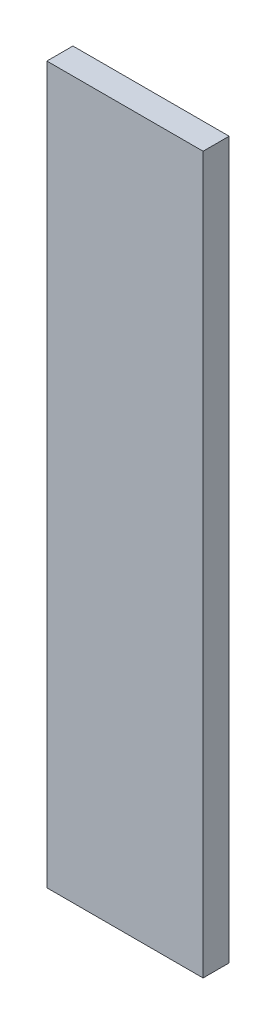
ISO-10303-21;
HEADER;
FILE_DESCRIPTION(('STEP AP214'),'2;1');
FILE_NAME('part.step','',(''),(''),'','','');
FILE_SCHEMA(('AUTOMOTIVE_DESIGN { 1 0 10303 214 1 1 1 1 }'));
ENDSEC;
DATA;
#1=APPLICATION_CONTEXT('core data for automotive mechanical design processes');
#2=APPLICATION_PROTOCOL_DEFINITION('international standard','automotive_design',2000,#1);
#3=PRODUCT_CONTEXT('',#1,'mechanical');
#4=PRODUCT('Part','Part','',(#3));
#5=PRODUCT_RELATED_PRODUCT_CATEGORY('part','',(#4));
#6=PRODUCT_DEFINITION_FORMATION('','',#4);
#7=PRODUCT_DEFINITION_CONTEXT('part definition',#1,'design');
#8=PRODUCT_DEFINITION('design','',#6,#7);
#9=PRODUCT_DEFINITION_SHAPE('','',#8);
#10=(LENGTH_UNIT() NAMED_UNIT(*) SI_UNIT(.MILLI.,.METRE.));
#11=(NAMED_UNIT(*) PLANE_ANGLE_UNIT() SI_UNIT($,.RADIAN.));
#12=(NAMED_UNIT(*) SI_UNIT($,.STERADIAN.) SOLID_ANGLE_UNIT());
#13=UNCERTAINTY_MEASURE_WITH_UNIT(LENGTH_MEASURE(1.E-05),#10,'distance_accuracy_value','');
#14=(GEOMETRIC_REPRESENTATION_CONTEXT(3) GLOBAL_UNCERTAINTY_ASSIGNED_CONTEXT((#13)) GLOBAL_UNIT_ASSIGNED_CONTEXT((#10,
#11,#12)) REPRESENTATION_CONTEXT('',''));
#15=CARTESIAN_POINT('',(0.,0.,0.));
#16=DIRECTION('',(0.,0.,1.));
#17=DIRECTION('',(1.,0.,0.));
#18=AXIS2_PLACEMENT_3D('',#15,#16,#17);
#19=CARTESIAN_POINT('',(-6.,27.5,2.));
#20=DIRECTION('',(1.,0.,0.));
#21=DIRECTION('',(0.,1.,0.));
#22=AXIS2_PLACEMENT_3D('',#19,#20,#21);
#23=PLANE('',#22);
#24=DIRECTION('',(0.,-1.,0.));
#25=VECTOR('',#24,1.);
#26=CARTESIAN_POINT('',(-6.,27.5,0.));
#27=LINE('',#26,#25);
#28=CARTESIAN_POINT('',(-6.,27.5,0.));
#29=VERTEX_POINT('',#28);
#30=CARTESIAN_POINT('',(-5.99999999999999,-27.5,0.));
#31=VERTEX_POINT('',#30);
#32=EDGE_CURVE('E113',#29,#31,#27,.T.);
#33=ORIENTED_EDGE('',*,*,#32,.T.);
#34=DIRECTION('',(0.,0.,-1.));
#35=VECTOR('',#34,1.);
#36=CARTESIAN_POINT('',(-5.99999999999999,-27.5,2.));
#37=LINE('',#36,#35);
#38=CARTESIAN_POINT('',(-5.99999999999999,-27.5,2.));
#39=VERTEX_POINT('',#38);
#40=EDGE_CURVE('E11',#39,#31,#37,.T.);
#41=ORIENTED_EDGE('',*,*,#40,.F.);
#42=DIRECTION('',(0.,-1.,0.));
#43=VECTOR('',#42,1.);
#44=CARTESIAN_POINT('',(-6.,27.5,2.));
#45=LINE('',#44,#43);
#46=CARTESIAN_POINT('',(-6.,27.5,2.));
#47=VERTEX_POINT('',#46);
#48=EDGE_CURVE('E97',#47,#39,#45,.T.);
#49=ORIENTED_EDGE('',*,*,#48,.F.);
#50=DIRECTION('',(0.,0.,-1.));
#51=VECTOR('',#50,1.);
#52=CARTESIAN_POINT('',(-6.,27.5,2.));
#53=LINE('',#52,#51);
#54=EDGE_CURVE('E109',#47,#29,#53,.T.);
#55=ORIENTED_EDGE('',*,*,#54,.T.);
#56=EDGE_LOOP('',(#33,#41,#49,#55));
#57=FACE_BOUND('',#56,.T.);
#58=ADVANCED_FACE('F45',(#57),#23,.F.);
#59=CARTESIAN_POINT('',(-5.99999999999999,-27.5,2.));
#60=DIRECTION('',(0.,1.,0.));
#61=DIRECTION('',(0.,0.,1.));
#62=AXIS2_PLACEMENT_3D('',#59,#60,#61);
#63=PLANE('',#62);
#64=DIRECTION('',(1.,0.,0.));
#65=VECTOR('',#64,1.);
#66=CARTESIAN_POINT('',(-5.99999999999999,-27.5,0.));
#67=LINE('',#66,#65);
#68=CARTESIAN_POINT('',(6.00000000000001,-27.5,0.));
#69=VERTEX_POINT('',#68);
#70=EDGE_CURVE('E102',#31,#69,#67,.T.);
#71=ORIENTED_EDGE('',*,*,#70,.T.);
#72=DIRECTION('',(0.,0.,-1.));
#73=VECTOR('',#72,1.);
#74=CARTESIAN_POINT('',(6.00000000000001,-27.5,2.));
#75=LINE('',#74,#73);
#76=CARTESIAN_POINT('',(6.00000000000001,-27.5,2.));
#77=VERTEX_POINT('',#76);
#78=EDGE_CURVE('E54',#77,#69,#75,.T.);
#79=ORIENTED_EDGE('',*,*,#78,.F.);
#80=DIRECTION('',(1.,0.,0.));
#81=VECTOR('',#80,1.);
#82=CARTESIAN_POINT('',(-5.99999999999999,-27.5,2.));
#83=LINE('',#82,#81);
#84=EDGE_CURVE('E92',#39,#77,#83,.T.);
#85=ORIENTED_EDGE('',*,*,#84,.F.);
#86=ORIENTED_EDGE('',*,*,#40,.T.);
#87=EDGE_LOOP('',(#71,#79,#85,#86));
#88=FACE_BOUND('',#87,.T.);
#89=ADVANCED_FACE('F101',(#88),#63,.F.);
#90=CARTESIAN_POINT('',(6.,27.5,2.));
#91=DIRECTION('',(-1.,0.,0.));
#92=DIRECTION('',(0.,-1.,0.));
#93=AXIS2_PLACEMENT_3D('',#90,#91,#92);
#94=PLANE('',#93);
#95=DIRECTION('',(0.,1.,0.));
#96=VECTOR('',#95,1.);
#97=CARTESIAN_POINT('',(6.,27.5,0.));
#98=LINE('',#97,#96);
#99=CARTESIAN_POINT('',(6.,27.5,0.));
#100=VERTEX_POINT('',#99);
#101=EDGE_CURVE('E79',#69,#100,#98,.T.);
#102=ORIENTED_EDGE('',*,*,#101,.T.);
#103=DIRECTION('',(0.,0.,-1.));
#104=VECTOR('',#103,1.);
#105=CARTESIAN_POINT('',(6.,27.5,2.));
#106=LINE('',#105,#104);
#107=CARTESIAN_POINT('',(6.,27.5,2.));
#108=VERTEX_POINT('',#107);
#109=EDGE_CURVE('E104',#108,#100,#106,.T.);
#110=ORIENTED_EDGE('',*,*,#109,.F.);
#111=DIRECTION('',(0.,1.,0.));
#112=VECTOR('',#111,1.);
#113=CARTESIAN_POINT('',(6.,27.5,2.));
#114=LINE('',#113,#112);
#115=EDGE_CURVE('E95',#77,#108,#114,.T.);
#116=ORIENTED_EDGE('',*,*,#115,.F.);
#117=ORIENTED_EDGE('',*,*,#78,.T.);
#118=EDGE_LOOP('',(#102,#110,#116,#117));
#119=FACE_BOUND('',#118,.T.);
#120=ADVANCED_FACE('F105',(#119),#94,.F.);
#121=CARTESIAN_POINT('',(-6.,27.5,2.));
#122=DIRECTION('',(0.,-1.,0.));
#123=DIRECTION('',(0.,0.,-1.));
#124=AXIS2_PLACEMENT_3D('',#121,#122,#123);
#125=PLANE('',#124);
#126=DIRECTION('',(-1.,0.,0.));
#127=VECTOR('',#126,1.);
#128=CARTESIAN_POINT('',(-6.,27.5,0.));
#129=LINE('',#128,#127);
#130=EDGE_CURVE('E85',#100,#29,#129,.T.);
#131=ORIENTED_EDGE('',*,*,#130,.T.);
#132=ORIENTED_EDGE('',*,*,#54,.F.);
#133=DIRECTION('',(-1.,0.,0.));
#134=VECTOR('',#133,1.);
#135=CARTESIAN_POINT('',(-6.,27.5,2.));
#136=LINE('',#135,#134);
#137=EDGE_CURVE('E62',#108,#47,#136,.T.);
#138=ORIENTED_EDGE('',*,*,#137,.F.);
#139=ORIENTED_EDGE('',*,*,#109,.T.);
#140=EDGE_LOOP('',(#131,#132,#138,#139));
#141=FACE_BOUND('',#140,.T.);
#142=ADVANCED_FACE('F126',(#141),#125,.F.);
#143=CARTESIAN_POINT('',(0.,0.,2.));
#144=DIRECTION('',(0.,0.,1.));
#145=DIRECTION('',(1.,0.,0.));
#146=AXIS2_PLACEMENT_3D('',#143,#144,#145);
#147=PLANE('',#146);
#148=ORIENTED_EDGE('',*,*,#48,.T.);
#149=ORIENTED_EDGE('',*,*,#84,.T.);
#150=ORIENTED_EDGE('',*,*,#115,.T.);
#151=ORIENTED_EDGE('',*,*,#137,.T.);
#152=EDGE_LOOP('',(#148,#149,#150,#151));
#153=FACE_BOUND('',#152,.T.);
#154=ADVANCED_FACE('F93',(#153),#147,.T.);
#155=CARTESIAN_POINT('',(0.,0.,0.));
#156=DIRECTION('',(0.,0.,1.));
#157=DIRECTION('',(1.,0.,0.));
#158=AXIS2_PLACEMENT_3D('',#155,#156,#157);
#159=PLANE('',#158);
#160=ORIENTED_EDGE('',*,*,#32,.F.);
#161=ORIENTED_EDGE('',*,*,#130,.F.);
#162=ORIENTED_EDGE('',*,*,#101,.F.);
#163=ORIENTED_EDGE('',*,*,#70,.F.);
#164=EDGE_LOOP('',(#160,#161,#162,#163));
#165=FACE_BOUND('',#164,.T.);
#166=ADVANCED_FACE('F129',(#165),#159,.F.);
#167=CLOSED_SHELL('',(#58,#89,#120,#142,#154,#166));
#168=MANIFOLD_SOLID_BREP('B2',#167);
#169=ADVANCED_BREP_SHAPE_REPRESENTATION('',(#18,#168),#14);
#170=SHAPE_DEFINITION_REPRESENTATION(#9,#169);
ENDSEC;
END-ISO-10303-21;
